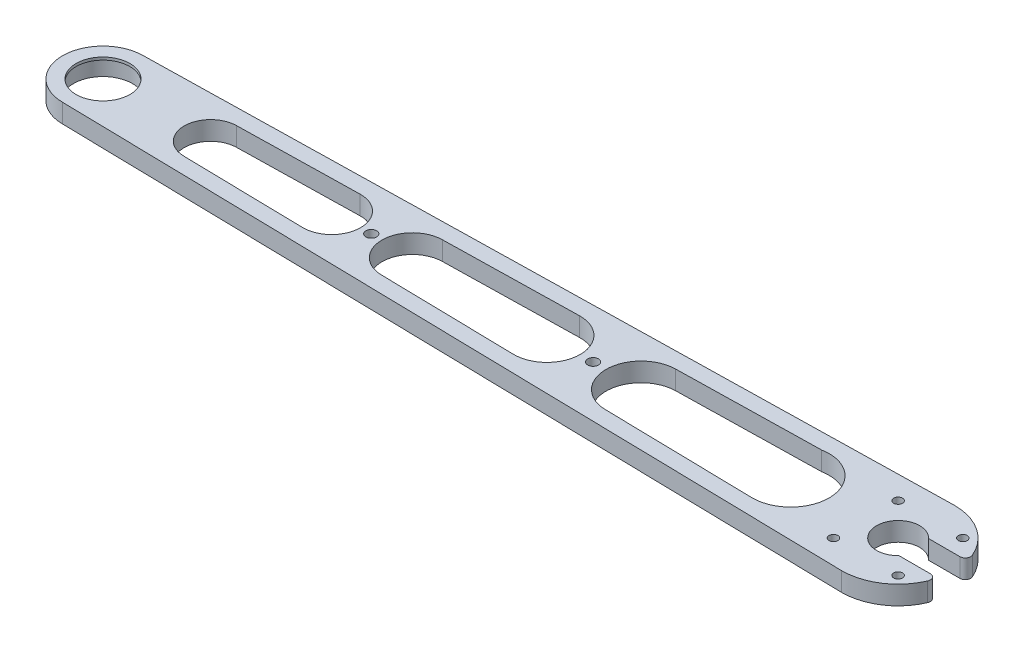
ISO-10303-21;
HEADER;
FILE_DESCRIPTION(('STEP AP214'),'2;1');
FILE_NAME('part.step','',(''),(''),'','','');
FILE_SCHEMA(('AUTOMOTIVE_DESIGN { 1 0 10303 214 1 1 1 1 }'));
ENDSEC;
DATA;
#1=APPLICATION_CONTEXT('core data for automotive mechanical design processes');
#2=APPLICATION_PROTOCOL_DEFINITION('international standard','automotive_design',2000,#1);
#3=PRODUCT_CONTEXT('',#1,'mechanical');
#4=PRODUCT('Part','Part','',(#3));
#5=PRODUCT_RELATED_PRODUCT_CATEGORY('part','',(#4));
#6=PRODUCT_DEFINITION_FORMATION('','',#4);
#7=PRODUCT_DEFINITION_CONTEXT('part definition',#1,'design');
#8=PRODUCT_DEFINITION('design','',#6,#7);
#9=PRODUCT_DEFINITION_SHAPE('','',#8);
#10=(LENGTH_UNIT() NAMED_UNIT(*) SI_UNIT(.MILLI.,.METRE.));
#11=(NAMED_UNIT(*) PLANE_ANGLE_UNIT() SI_UNIT($,.RADIAN.));
#12=(NAMED_UNIT(*) SI_UNIT($,.STERADIAN.) SOLID_ANGLE_UNIT());
#13=UNCERTAINTY_MEASURE_WITH_UNIT(LENGTH_MEASURE(1.E-05),#10,'distance_accuracy_value','');
#14=(GEOMETRIC_REPRESENTATION_CONTEXT(3) GLOBAL_UNCERTAINTY_ASSIGNED_CONTEXT((#13)) GLOBAL_UNIT_ASSIGNED_CONTEXT((#10,
#11,#12)) REPRESENTATION_CONTEXT('',''));
#15=CARTESIAN_POINT('',(0.,0.,0.));
#16=DIRECTION('',(0.,0.,1.));
#17=DIRECTION('',(1.,0.,0.));
#18=AXIS2_PLACEMENT_3D('',#15,#16,#17);
#19=CARTESIAN_POINT('',(264.937460861042,7.,7.5));
#20=DIRECTION('',(0.,-1.,0.));
#21=DIRECTION('',(0.,0.,-1.));
#22=AXIS2_PLACEMENT_3D('',#19,#20,#21);
#23=CYLINDRICAL_SURFACE('',#22,2.);
#24=CARTESIAN_POINT('',(264.937460861042,0.,7.5));
#25=DIRECTION('',(0.,1.,0.));
#26=DIRECTION('',(0.,0.,1.));
#27=AXIS2_PLACEMENT_3D('',#24,#25,#26);
#28=CIRCLE('',#27,2.);
#29=CARTESIAN_POINT('',(264.937460861042,0.,5.5));
#30=VERTEX_POINT('',#29);
#31=CARTESIAN_POINT('',(266.775049308421,0.,8.28947368421055));
#32=VERTEX_POINT('',#31);
#33=EDGE_CURVE('E353',#30,#32,#28,.F.);
#34=ORIENTED_EDGE('',*,*,#33,.F.);
#35=DIRECTION('',(0.,-1.,0.));
#36=VECTOR('',#35,1.);
#37=CARTESIAN_POINT('',(264.937460861042,7.,5.5));
#38=LINE('',#37,#36);
#39=CARTESIAN_POINT('',(264.937460861042,7.,5.5));
#40=VERTEX_POINT('',#39);
#41=EDGE_CURVE('E11',#40,#30,#38,.T.);
#42=ORIENTED_EDGE('',*,*,#41,.F.);
#43=CARTESIAN_POINT('',(264.937460861042,7.,7.5));
#44=DIRECTION('',(0.,1.,0.));
#45=DIRECTION('',(0.,0.,1.));
#46=AXIS2_PLACEMENT_3D('',#43,#44,#45);
#47=CIRCLE('',#46,2.);
#48=CARTESIAN_POINT('',(266.775049308421,7.,8.28947368421055));
#49=VERTEX_POINT('',#48);
#50=EDGE_CURVE('E357',#40,#49,#47,.F.);
#51=ORIENTED_EDGE('',*,*,#50,.T.);
#52=DIRECTION('',(0.,-1.,0.));
#53=VECTOR('',#52,1.);
#54=CARTESIAN_POINT('',(266.775049308421,7.,8.28947368421055));
#55=LINE('',#54,#53);
#56=EDGE_CURVE('E385',#49,#32,#55,.T.);
#57=ORIENTED_EDGE('',*,*,#56,.T.);
#58=EDGE_LOOP('',(#34,#42,#51,#57));
#59=FACE_BOUND('',#58,.T.);
#60=ADVANCED_FACE('F45',(#59),#23,.T.);
#61=CARTESIAN_POINT('',(0.,7.,5.49999999999998));
#62=DIRECTION('',(0.,0.,-1.));
#63=DIRECTION('',(-1.,0.,0.));
#64=AXIS2_PLACEMENT_3D('',#61,#62,#63);
#65=PLANE('',#64);
#66=DIRECTION('',(1.,0.,0.));
#67=VECTOR('',#66,1.);
#68=CARTESIAN_POINT('',(0.,0.,5.49999999999998));
#69=LINE('',#68,#67);
#70=CARTESIAN_POINT('',(253.289845630257,0.,5.5));
#71=VERTEX_POINT('',#70);
#72=EDGE_CURVE('E388',#71,#30,#69,.T.);
#73=ORIENTED_EDGE('',*,*,#72,.F.);
#74=DIRECTION('',(0.,-1.,0.));
#75=VECTOR('',#74,1.);
#76=CARTESIAN_POINT('',(253.289845630257,7.,5.5));
#77=LINE('',#76,#75);
#78=CARTESIAN_POINT('',(253.289845630257,7.,5.5));
#79=VERTEX_POINT('',#78);
#80=EDGE_CURVE('E54',#79,#71,#77,.T.);
#81=ORIENTED_EDGE('',*,*,#80,.F.);
#82=DIRECTION('',(1.,0.,0.));
#83=VECTOR('',#82,1.);
#84=CARTESIAN_POINT('',(0.,7.,5.49999999999998));
#85=LINE('',#84,#83);
#86=EDGE_CURVE('E361',#79,#40,#85,.T.);
#87=ORIENTED_EDGE('',*,*,#86,.T.);
#88=ORIENTED_EDGE('',*,*,#41,.T.);
#89=EDGE_LOOP('',(#73,#81,#87,#88));
#90=FACE_BOUND('',#89,.T.);
#91=ADVANCED_FACE('F457',(#90),#65,.T.);
#92=CARTESIAN_POINT('',(247.480370610946,7.,0.));
#93=DIRECTION('',(0.,-1.,0.));
#94=DIRECTION('',(0.,0.,-1.));
#95=AXIS2_PLACEMENT_3D('',#92,#93,#94);
#96=CYLINDRICAL_SURFACE('',#95,7.99999999999999);
#97=CARTESIAN_POINT('',(247.480370610946,0.,0.));
#98=DIRECTION('',(0.,1.,0.));
#99=DIRECTION('',(0.,0.,1.));
#100=AXIS2_PLACEMENT_3D('',#97,#98,#99);
#101=CIRCLE('',#100,7.99999999999999);
#102=CARTESIAN_POINT('',(253.289845630257,0.,-5.5));
#103=VERTEX_POINT('',#102);
#104=EDGE_CURVE('E391',#103,#71,#101,.T.);
#105=ORIENTED_EDGE('',*,*,#104,.F.);
#106=DIRECTION('',(0.,-1.,0.));
#107=VECTOR('',#106,1.);
#108=CARTESIAN_POINT('',(253.289845630257,7.,-5.5));
#109=LINE('',#108,#107);
#110=CARTESIAN_POINT('',(253.289845630257,7.,-5.5));
#111=VERTEX_POINT('',#110);
#112=EDGE_CURVE('E429',#111,#103,#109,.T.);
#113=ORIENTED_EDGE('',*,*,#112,.F.);
#114=CARTESIAN_POINT('',(247.480370610946,7.,0.));
#115=DIRECTION('',(0.,1.,0.));
#116=DIRECTION('',(0.,0.,1.));
#117=AXIS2_PLACEMENT_3D('',#114,#115,#116);
#118=CIRCLE('',#117,7.99999999999999);
#119=EDGE_CURVE('E364',#111,#79,#118,.T.);
#120=ORIENTED_EDGE('',*,*,#119,.T.);
#121=ORIENTED_EDGE('',*,*,#80,.T.);
#122=EDGE_LOOP('',(#105,#113,#120,#121));
#123=FACE_BOUND('',#122,.T.);
#124=ADVANCED_FACE('F462',(#123),#96,.F.);
#125=CARTESIAN_POINT('',(0.,7.,-5.5));
#126=DIRECTION('',(0.,0.,-1.));
#127=DIRECTION('',(-1.,0.,0.));
#128=AXIS2_PLACEMENT_3D('',#125,#126,#127);
#129=PLANE('',#128);
#130=DIRECTION('',(1.,0.,0.));
#131=VECTOR('',#130,1.);
#132=CARTESIAN_POINT('',(0.,0.,-5.5));
#133=LINE('',#132,#131);
#134=CARTESIAN_POINT('',(264.937460861042,0.,-5.5));
#135=VERTEX_POINT('',#134);
#136=EDGE_CURVE('E394',#103,#135,#133,.T.);
#137=ORIENTED_EDGE('',*,*,#136,.T.);
#138=DIRECTION('',(0.,-1.,0.));
#139=VECTOR('',#138,1.);
#140=CARTESIAN_POINT('',(264.937460861042,7.,-5.5));
#141=LINE('',#140,#139);
#142=CARTESIAN_POINT('',(264.937460861042,7.,-5.5));
#143=VERTEX_POINT('',#142);
#144=EDGE_CURVE('E426',#143,#135,#141,.T.);
#145=ORIENTED_EDGE('',*,*,#144,.F.);
#146=DIRECTION('',(1.,0.,0.));
#147=VECTOR('',#146,1.);
#148=CARTESIAN_POINT('',(0.,7.,-5.5));
#149=LINE('',#148,#147);
#150=EDGE_CURVE('E367',#111,#143,#149,.T.);
#151=ORIENTED_EDGE('',*,*,#150,.F.);
#152=ORIENTED_EDGE('',*,*,#112,.T.);
#153=EDGE_LOOP('',(#137,#145,#151,#152));
#154=FACE_BOUND('',#153,.T.);
#155=ADVANCED_FACE('F469',(#154),#129,.F.);
#156=CARTESIAN_POINT('',(264.937460861042,7.,-7.5));
#157=DIRECTION('',(0.,-1.,0.));
#158=DIRECTION('',(0.,0.,-1.));
#159=AXIS2_PLACEMENT_3D('',#156,#157,#158);
#160=CYLINDRICAL_SURFACE('',#159,2.);
#161=CARTESIAN_POINT('',(264.937460861042,0.,-7.5));
#162=DIRECTION('',(0.,1.,0.));
#163=DIRECTION('',(0.,0.,1.));
#164=AXIS2_PLACEMENT_3D('',#161,#162,#163);
#165=CIRCLE('',#164,2.);
#166=CARTESIAN_POINT('',(266.775049308421,0.,-8.28947368421055));
#167=VERTEX_POINT('',#166);
#168=EDGE_CURVE('E397',#135,#167,#165,.T.);
#169=ORIENTED_EDGE('',*,*,#168,.T.);
#170=DIRECTION('',(0.,-1.,0.));
#171=VECTOR('',#170,1.);
#172=CARTESIAN_POINT('',(266.775049308421,7.,-8.28947368421055));
#173=LINE('',#172,#171);
#174=CARTESIAN_POINT('',(266.775049308421,7.,-8.28947368421055));
#175=VERTEX_POINT('',#174);
#176=EDGE_CURVE('E423',#175,#167,#173,.T.);
#177=ORIENTED_EDGE('',*,*,#176,.F.);
#178=CARTESIAN_POINT('',(264.937460861042,7.,-7.5));
#179=DIRECTION('',(0.,1.,0.));
#180=DIRECTION('',(0.,0.,1.));
#181=AXIS2_PLACEMENT_3D('',#178,#179,#180);
#182=CIRCLE('',#181,2.);
#183=EDGE_CURVE('E370',#143,#175,#182,.T.);
#184=ORIENTED_EDGE('',*,*,#183,.F.);
#185=ORIENTED_EDGE('',*,*,#144,.T.);
#186=EDGE_LOOP('',(#169,#177,#184,#185));
#187=FACE_BOUND('',#186,.T.);
#188=ADVANCED_FACE('F473',(#187),#160,.T.);
#189=CARTESIAN_POINT('',(247.480370610946,7.,0.));
#190=DIRECTION('',(0.,-1.,0.));
#191=DIRECTION('',(0.,0.,-1.));
#192=AXIS2_PLACEMENT_3D('',#189,#190,#191);
#193=CYLINDRICAL_SURFACE('',#192,21.);
#194=CARTESIAN_POINT('',(247.480370610946,0.,0.));
#195=DIRECTION('',(0.,1.,0.));
#196=DIRECTION('',(0.,0.,1.));
#197=AXIS2_PLACEMENT_3D('',#194,#195,#196);
#198=CIRCLE('',#197,21.);
#199=CARTESIAN_POINT('',(247.480370610946,0.,-21.));
#200=VERTEX_POINT('',#199);
#201=EDGE_CURVE('E400',#167,#200,#198,.T.);
#202=ORIENTED_EDGE('',*,*,#201,.T.);
#203=DIRECTION('',(0.,-1.,0.));
#204=VECTOR('',#203,1.);
#205=CARTESIAN_POINT('',(247.480370610946,7.,-21.));
#206=LINE('',#205,#204);
#207=CARTESIAN_POINT('',(247.480370610946,7.,-21.));
#208=VERTEX_POINT('',#207);
#209=EDGE_CURVE('E421',#208,#200,#206,.T.);
#210=ORIENTED_EDGE('',*,*,#209,.F.);
#211=CARTESIAN_POINT('',(247.480370610946,7.,0.));
#212=DIRECTION('',(0.,1.,0.));
#213=DIRECTION('',(0.,0.,1.));
#214=AXIS2_PLACEMENT_3D('',#211,#212,#213);
#215=CIRCLE('',#214,21.);
#216=EDGE_CURVE('E373',#175,#208,#215,.T.);
#217=ORIENTED_EDGE('',*,*,#216,.F.);
#218=ORIENTED_EDGE('',*,*,#176,.T.);
#219=EDGE_LOOP('',(#202,#210,#217,#218));
#220=FACE_BOUND('',#219,.T.);
#221=ADVANCED_FACE('F477',(#220),#193,.T.);
#222=CARTESIAN_POINT('',(-0.324232171802316,7.,-15.968434461264));
#223=DIRECTION('',(-0.0203003842835679,0.,-0.999793925965716));
#224=DIRECTION('',(-0.999793925965716,0.,0.0203003842835679));
#225=AXIS2_PLACEMENT_3D('',#222,#223,#224);
#226=PLANE('',#225);
#227=DIRECTION('',(0.999793925965716,0.,-0.0203003842835679));
#228=VECTOR('',#227,1.);
#229=CARTESIAN_POINT('',(-0.324232171802316,0.,-15.968434461264));
#230=LINE('',#229,#228);
#231=CARTESIAN_POINT('',(-48.019629389054,0.,-15.));
#232=VERTEX_POINT('',#231);
#233=EDGE_CURVE('E403',#232,#200,#230,.T.);
#234=ORIENTED_EDGE('',*,*,#233,.F.);
#235=DIRECTION('',(0.,-1.,0.));
#236=VECTOR('',#235,1.);
#237=CARTESIAN_POINT('',(-48.019629389054,7.,-15.));
#238=LINE('',#237,#236);
#239=CARTESIAN_POINT('',(-48.019629389054,7.,-15.));
#240=VERTEX_POINT('',#239);
#241=EDGE_CURVE('E419',#240,#232,#238,.T.);
#242=ORIENTED_EDGE('',*,*,#241,.F.);
#243=DIRECTION('',(0.999793925965716,0.,-0.0203003842835679));
#244=VECTOR('',#243,1.);
#245=CARTESIAN_POINT('',(-0.324232171802316,7.,-15.968434461264));
#246=LINE('',#245,#244);
#247=EDGE_CURVE('E375',#240,#208,#246,.T.);
#248=ORIENTED_EDGE('',*,*,#247,.T.);
#249=ORIENTED_EDGE('',*,*,#209,.T.);
#250=EDGE_LOOP('',(#234,#242,#248,#249));
#251=FACE_BOUND('',#250,.T.);
#252=ADVANCED_FACE('F481',(#251),#226,.T.);
#253=CARTESIAN_POINT('',(-48.019629389054,7.,0.));
#254=DIRECTION('',(0.,-1.,0.));
#255=DIRECTION('',(0.,0.,-1.));
#256=AXIS2_PLACEMENT_3D('',#253,#254,#255);
#257=CYLINDRICAL_SURFACE('',#256,15.);
#258=CARTESIAN_POINT('',(-48.019629389054,0.,0.));
#259=DIRECTION('',(0.,1.,0.));
#260=DIRECTION('',(0.,0.,1.));
#261=AXIS2_PLACEMENT_3D('',#258,#259,#260);
#262=CIRCLE('',#261,15.);
#263=CARTESIAN_POINT('',(-48.019629389054,0.,15.));
#264=VERTEX_POINT('',#263);
#265=EDGE_CURVE('E406',#232,#264,#262,.T.);
#266=ORIENTED_EDGE('',*,*,#265,.T.);
#267=DIRECTION('',(0.,-1.,0.));
#268=VECTOR('',#267,1.);
#269=CARTESIAN_POINT('',(-48.019629389054,7.,15.));
#270=LINE('',#269,#268);
#271=CARTESIAN_POINT('',(-48.019629389054,7.,15.));
#272=VERTEX_POINT('',#271);
#273=EDGE_CURVE('E417',#272,#264,#270,.T.);
#274=ORIENTED_EDGE('',*,*,#273,.F.);
#275=CARTESIAN_POINT('',(-48.019629389054,7.,0.));
#276=DIRECTION('',(0.,1.,0.));
#277=DIRECTION('',(0.,0.,1.));
#278=AXIS2_PLACEMENT_3D('',#275,#276,#277);
#279=CIRCLE('',#278,15.);
#280=EDGE_CURVE('E378',#240,#272,#279,.T.);
#281=ORIENTED_EDGE('',*,*,#280,.F.);
#282=ORIENTED_EDGE('',*,*,#241,.T.);
#283=EDGE_LOOP('',(#266,#274,#281,#282));
#284=FACE_BOUND('',#283,.T.);
#285=ADVANCED_FACE('F485',(#284),#257,.T.);
#286=CARTESIAN_POINT('',(-0.324232171802316,7.,15.968434461264));
#287=DIRECTION('',(-0.0203003842835679,0.,0.999793925965716));
#288=DIRECTION('',(0.999793925965716,0.,0.0203003842835679));
#289=AXIS2_PLACEMENT_3D('',#286,#287,#288);
#290=PLANE('',#289);
#291=DIRECTION('',(-0.999793925965716,0.,-0.0203003842835679));
#292=VECTOR('',#291,1.);
#293=CARTESIAN_POINT('',(-0.324232171802316,0.,15.968434461264));
#294=LINE('',#293,#292);
#295=CARTESIAN_POINT('',(247.480370610946,0.,21.));
#296=VERTEX_POINT('',#295);
#297=EDGE_CURVE('E409',#296,#264,#294,.T.);
#298=ORIENTED_EDGE('',*,*,#297,.F.);
#299=DIRECTION('',(0.,-1.,0.));
#300=VECTOR('',#299,1.);
#301=CARTESIAN_POINT('',(247.480370610946,7.,21.));
#302=LINE('',#301,#300);
#303=CARTESIAN_POINT('',(247.480370610946,7.,21.));
#304=VERTEX_POINT('',#303);
#305=EDGE_CURVE('E415',#304,#296,#302,.T.);
#306=ORIENTED_EDGE('',*,*,#305,.F.);
#307=DIRECTION('',(-0.999793925965716,0.,-0.0203003842835679));
#308=VECTOR('',#307,1.);
#309=CARTESIAN_POINT('',(-0.324232171802316,7.,15.968434461264));
#310=LINE('',#309,#308);
#311=EDGE_CURVE('E380',#304,#272,#310,.T.);
#312=ORIENTED_EDGE('',*,*,#311,.T.);
#313=ORIENTED_EDGE('',*,*,#273,.T.);
#314=EDGE_LOOP('',(#298,#306,#312,#313));
#315=FACE_BOUND('',#314,.T.);
#316=ADVANCED_FACE('F489',(#315),#290,.T.);
#317=CARTESIAN_POINT('',(-48.019629389054,7.,0.));
#318=DIRECTION('',(0.,-1.,0.));
#319=DIRECTION('',(0.,0.,-1.));
#320=AXIS2_PLACEMENT_3D('',#317,#318,#319);
#321=CYLINDRICAL_SURFACE('',#320,10.);
#322=CARTESIAN_POINT('',(-48.019629389054,6.,0.));
#323=DIRECTION('',(0.,1.,0.));
#324=DIRECTION('',(0.,0.,1.));
#325=AXIS2_PLACEMENT_3D('',#322,#323,#324);
#326=CIRCLE('',#325,10.);
#327=CARTESIAN_POINT('',(-48.019629389054,6.,10.));
#328=VERTEX_POINT('',#327);
#329=EDGE_CURVE('E49',#328,#328,#326,.T.);
#330=ORIENTED_EDGE('',*,*,#329,.F.);
#331=EDGE_LOOP('',(#330));
#332=FACE_BOUND('',#331,.T.);
#333=CARTESIAN_POINT('',(-48.019629389054,7.,0.));
#334=DIRECTION('',(0.,1.,0.));
#335=DIRECTION('',(0.,0.,1.));
#336=AXIS2_PLACEMENT_3D('',#333,#334,#335);
#337=CIRCLE('',#336,10.);
#338=CARTESIAN_POINT('',(-48.019629389054,7.,10.));
#339=VERTEX_POINT('',#338);
#340=EDGE_CURVE('E354',#339,#339,#337,.T.);
#341=ORIENTED_EDGE('',*,*,#340,.T.);
#342=EDGE_LOOP('',(#341));
#343=FACE_BOUND('',#342,.T.);
#344=ADVANCED_FACE('F47',(#332,#343),#321,.F.);
#345=CARTESIAN_POINT('',(247.480370610946,7.,0.));
#346=DIRECTION('',(0.,-1.,0.));
#347=DIRECTION('',(0.,0.,-1.));
#348=AXIS2_PLACEMENT_3D('',#345,#346,#347);
#349=CYLINDRICAL_SURFACE('',#348,21.);
#350=CARTESIAN_POINT('',(247.480370610946,0.,0.));
#351=DIRECTION('',(0.,1.,0.));
#352=DIRECTION('',(0.,0.,1.));
#353=AXIS2_PLACEMENT_3D('',#350,#351,#352);
#354=CIRCLE('',#353,21.);
#355=EDGE_CURVE('E358',#296,#32,#354,.T.);
#356=ORIENTED_EDGE('',*,*,#355,.T.);
#357=ORIENTED_EDGE('',*,*,#56,.F.);
#358=CARTESIAN_POINT('',(247.480370610946,7.,0.));
#359=DIRECTION('',(0.,1.,0.));
#360=DIRECTION('',(0.,0.,1.));
#361=AXIS2_PLACEMENT_3D('',#358,#359,#360);
#362=CIRCLE('',#361,21.);
#363=EDGE_CURVE('E383',#304,#49,#362,.T.);
#364=ORIENTED_EDGE('',*,*,#363,.F.);
#365=ORIENTED_EDGE('',*,*,#305,.T.);
#366=EDGE_LOOP('',(#356,#357,#364,#365));
#367=FACE_BOUND('',#366,.T.);
#368=ADVANCED_FACE('F494',(#367),#349,.T.);
#369=CARTESIAN_POINT('',(0.,7.,0.));
#370=DIRECTION('',(0.,1.,0.));
#371=DIRECTION('',(0.,0.,1.));
#372=AXIS2_PLACEMENT_3D('',#369,#370,#371);
#373=PLANE('',#372);
#374=CARTESIAN_POINT('',(-8.01962938905402,7.,0.));
#375=DIRECTION('',(0.,-1.,0.));
#376=DIRECTION('',(0.,0.,-1.));
#377=AXIS2_PLACEMENT_3D('',#374,#375,#376);
#378=CIRCLE('',#377,9.80892426082845);
#379=CARTESIAN_POINT('',(-8.21875432095725,7.,9.80690289623403));
#380=VERTEX_POINT('',#379);
#381=CARTESIAN_POINT('',(-8.21875432095725,7.,-9.80690289623404));
#382=VERTEX_POINT('',#381);
#383=EDGE_CURVE('E205',#380,#382,#378,.T.);
#384=ORIENTED_EDGE('',*,*,#383,.T.);
#385=DIRECTION('',(0.999793925965716,0.,-0.020300384283568));
#386=VECTOR('',#385,1.);
#387=CARTESIAN_POINT('',(-8.21875432095725,7.,-9.80690289623404));
#388=LINE('',#387,#386);
#389=CARTESIAN_POINT('',(36.7627009269499,7.,-10.7202319368007));
#390=VERTEX_POINT('',#389);
#391=EDGE_CURVE('E216',#382,#390,#388,.T.);
#392=ORIENTED_EDGE('',*,*,#391,.T.);
#393=CARTESIAN_POINT('',(36.9803706109458,7.,0.));
#394=DIRECTION('',(0.,-1.,0.));
#395=DIRECTION('',(0.,0.,1.));
#396=AXIS2_PLACEMENT_3D('',#393,#394,#395);
#397=CIRCLE('',#396,10.722441553589);
#398=CARTESIAN_POINT('',(36.7627009269499,7.,10.7202319368007));
#399=VERTEX_POINT('',#398);
#400=EDGE_CURVE('E62',#390,#399,#397,.T.);
#401=ORIENTED_EDGE('',*,*,#400,.T.);
#402=DIRECTION('',(-0.999793925965716,0.,-0.0203003842835682));
#403=VECTOR('',#402,1.);
#404=CARTESIAN_POINT('',(-8.21875432095725,7.,9.80690289623403));
#405=LINE('',#404,#403);
#406=EDGE_CURVE('E213',#399,#380,#405,.T.);
#407=ORIENTED_EDGE('',*,*,#406,.T.);
#408=EDGE_LOOP('',(#384,#392,#401,#407));
#409=FACE_BOUND('',#408,.T.);
#410=CARTESIAN_POINT('',(51.6758648466924,7.,0.));
#411=DIRECTION('',(0.,-1.,0.));
#412=DIRECTION('',(0.,0.,-1.));
#413=AXIS2_PLACEMENT_3D('',#410,#411,#412);
#414=CIRCLE('',#413,2.);
#415=CARTESIAN_POINT('',(51.6758648466924,7.,-2.00000000000003));
#416=VERTEX_POINT('',#415);
#417=EDGE_CURVE('E250',#416,#416,#414,.T.);
#418=ORIENTED_EDGE('',*,*,#417,.T.);
#419=EDGE_LOOP('',(#418));
#420=FACE_BOUND('',#419,.T.);
#421=CARTESIAN_POINT('',(134.125113885984,7.,0.));
#422=DIRECTION('',(0.,-1.,0.));
#423=DIRECTION('',(0.,0.,-1.));
#424=AXIS2_PLACEMENT_3D('',#421,#422,#423);
#425=CIRCLE('',#424,2.);
#426=CARTESIAN_POINT('',(134.125113885984,7.,-2.00000000000003));
#427=VERTEX_POINT('',#426);
#428=EDGE_CURVE('E243',#427,#427,#425,.T.);
#429=ORIENTED_EDGE('',*,*,#428,.T.);
#430=EDGE_LOOP('',(#429));
#431=FACE_BOUND('',#430,.T.);
#432=CARTESIAN_POINT('',(66.9803706109442,7.,0.));
#433=DIRECTION('',(0.,-1.,0.));
#434=DIRECTION('',(0.,0.,1.));
#435=AXIS2_PLACEMENT_3D('',#432,#433,#434);
#436=CIRCLE('',#435,11.331453082096);
#437=CARTESIAN_POINT('',(66.7503377588864,7.,11.3291179638451));
#438=VERTEX_POINT('',#437);
#439=CARTESIAN_POINT('',(66.7503377588865,7.,-11.3291179638451));
#440=VERTEX_POINT('',#439);
#441=EDGE_CURVE('E288',#438,#440,#436,.T.);
#442=ORIENTED_EDGE('',*,*,#441,.T.);
#443=DIRECTION('',(0.999793925965716,0.,-0.0203003842835679));
#444=VECTOR('',#443,1.);
#445=CARTESIAN_POINT('',(66.7503377588865,7.,-11.3291179638451));
#446=LINE('',#445,#444);
#447=CARTESIAN_POINT('',(116.729732478784,7.,-12.3439280089191));
#448=VERTEX_POINT('',#447);
#449=EDGE_CURVE('E291',#440,#448,#446,.T.);
#450=ORIENTED_EDGE('',*,*,#449,.T.);
#451=CARTESIAN_POINT('',(116.980370610944,7.,0.));
#452=DIRECTION('',(0.,-1.,0.));
#453=DIRECTION('',(0.,0.,-1.));
#454=AXIS2_PLACEMENT_3D('',#451,#452,#453);
#455=CIRCLE('',#454,12.3464722962744);
#456=CARTESIAN_POINT('',(116.729732478784,7.,12.3439280089192));
#457=VERTEX_POINT('',#456);
#458=EDGE_CURVE('E70',#448,#457,#455,.T.);
#459=ORIENTED_EDGE('',*,*,#458,.T.);
#460=DIRECTION('',(-0.999793925965716,0.,-0.020300384283568));
#461=VECTOR('',#460,1.);
#462=CARTESIAN_POINT('',(66.7503377588864,7.,11.3291179638451));
#463=LINE('',#462,#461);
#464=EDGE_CURVE('E296',#457,#438,#463,.T.);
#465=ORIENTED_EDGE('',*,*,#464,.T.);
#466=EDGE_LOOP('',(#442,#450,#459,#465));
#467=FACE_BOUND('',#466,.T.);
#468=CARTESIAN_POINT('',(207.480474963479,7.,-0.0913684395745021));
#469=DIRECTION('',(0.,-1.,0.));
#470=DIRECTION('',(0.,0.,1.));
#471=AXIS2_PLACEMENT_3D('',#468,#469,#470);
#472=CIRCLE('',#471,14.2750088032454);
#473=CARTESIAN_POINT('',(204.918313244168,7.,-14.1345590904498));
#474=VERTEX_POINT('',#473);
#475=CARTESIAN_POINT('',(207.190686799122,7.,14.1806986550174));
#476=VERTEX_POINT('',#475);
#477=EDGE_CURVE('E256',#474,#476,#472,.T.);
#478=ORIENTED_EDGE('',*,*,#477,.T.);
#479=DIRECTION('',(-0.999793925965716,0.,-0.020300384283568));
#480=VECTOR('',#479,1.);
#481=CARTESIAN_POINT('',(151.715308782712,7.,13.054295040471));
#482=LINE('',#481,#480);
#483=CARTESIAN_POINT('',(151.715308782712,7.,13.054295040471));
#484=VERTEX_POINT('',#483);
#485=EDGE_CURVE('E259',#476,#484,#482,.T.);
#486=ORIENTED_EDGE('',*,*,#485,.T.);
#487=CARTESIAN_POINT('',(151.980370610945,7.,0.));
#488=DIRECTION('',(0.,-1.,0.));
#489=DIRECTION('',(0.,0.,1.));
#490=AXIS2_PLACEMENT_3D('',#487,#488,#489);
#491=CIRCLE('',#490,13.0569857461993);
#492=CARTESIAN_POINT('',(151.715308782712,7.,-13.054295040471));
#493=VERTEX_POINT('',#492);
#494=EDGE_CURVE('E263',#484,#493,#491,.T.);
#495=ORIENTED_EDGE('',*,*,#494,.T.);
#496=DIRECTION('',(0.999793925965716,0.,-0.0203003842835679));
#497=VECTOR('',#496,1.);
#498=CARTESIAN_POINT('',(151.715308782712,7.,-13.054295040471));
#499=LINE('',#498,#497);
#500=EDGE_CURVE('E266',#493,#474,#499,.T.);
#501=ORIENTED_EDGE('',*,*,#500,.T.);
#502=EDGE_LOOP('',(#478,#486,#495,#501));
#503=FACE_BOUND('',#502,.T.);
#504=CARTESIAN_POINT('',(235.459555330775,7.,-12.0208152801712));
#505=DIRECTION('',(0.,1.,0.));
#506=DIRECTION('',(0.,0.,1.));
#507=AXIS2_PLACEMENT_3D('',#504,#505,#506);
#508=CIRCLE('',#507,1.65000000000001);
#509=CARTESIAN_POINT('',(235.459555330775,7.,-10.3708152801712));
#510=VERTEX_POINT('',#509);
#511=EDGE_CURVE('E333',#510,#510,#508,.T.);
#512=ORIENTED_EDGE('',*,*,#511,.F.);
#513=EDGE_LOOP('',(#512));
#514=FACE_BOUND('',#513,.T.);
#515=CARTESIAN_POINT('',(235.459555330775,7.,12.0208152801715));
#516=DIRECTION('',(0.,1.,0.));
#517=DIRECTION('',(0.,0.,1.));
#518=AXIS2_PLACEMENT_3D('',#515,#516,#517);
#519=CIRCLE('',#518,1.65000000000001);
#520=CARTESIAN_POINT('',(235.459555330775,7.,13.6708152801716));
#521=VERTEX_POINT('',#520);
#522=EDGE_CURVE('E337',#521,#521,#519,.T.);
#523=ORIENTED_EDGE('',*,*,#522,.F.);
#524=EDGE_LOOP('',(#523));
#525=FACE_BOUND('',#524,.T.);
#526=CARTESIAN_POINT('',(259.501185891117,7.,12.0208152801711));
#527=DIRECTION('',(0.,1.,0.));
#528=DIRECTION('',(0.,0.,1.));
#529=AXIS2_PLACEMENT_3D('',#526,#527,#528);
#530=CIRCLE('',#529,1.64999999999998);
#531=CARTESIAN_POINT('',(259.501185891117,7.,13.6708152801711));
#532=VERTEX_POINT('',#531);
#533=EDGE_CURVE('E343',#532,#532,#530,.T.);
#534=ORIENTED_EDGE('',*,*,#533,.F.);
#535=EDGE_LOOP('',(#534));
#536=FACE_BOUND('',#535,.T.);
#537=CARTESIAN_POINT('',(259.501185891117,7.,-12.0208152801715));
#538=DIRECTION('',(0.,1.,0.));
#539=DIRECTION('',(0.,0.,1.));
#540=AXIS2_PLACEMENT_3D('',#537,#538,#539);
#541=CIRCLE('',#540,1.64999999999998);
#542=CARTESIAN_POINT('',(259.501185891117,7.,-10.3708152801716));
#543=VERTEX_POINT('',#542);
#544=EDGE_CURVE('E347',#543,#543,#541,.T.);
#545=ORIENTED_EDGE('',*,*,#544,.F.);
#546=EDGE_LOOP('',(#545));
#547=FACE_BOUND('',#546,.T.);
#548=ORIENTED_EDGE('',*,*,#340,.F.);
#549=EDGE_LOOP('',(#548));
#550=FACE_BOUND('',#549,.T.);
#551=ORIENTED_EDGE('',*,*,#50,.F.);
#552=ORIENTED_EDGE('',*,*,#86,.F.);
#553=ORIENTED_EDGE('',*,*,#119,.F.);
#554=ORIENTED_EDGE('',*,*,#150,.T.);
#555=ORIENTED_EDGE('',*,*,#183,.T.);
#556=ORIENTED_EDGE('',*,*,#216,.T.);
#557=ORIENTED_EDGE('',*,*,#247,.F.);
#558=ORIENTED_EDGE('',*,*,#280,.T.);
#559=ORIENTED_EDGE('',*,*,#311,.F.);
#560=ORIENTED_EDGE('',*,*,#363,.T.);
#561=EDGE_LOOP('',(#551,#552,#553,#554,#555,#556,#557,#558,#559,#560));
#562=FACE_BOUND('',#561,.T.);
#563=ADVANCED_FACE('F220',(#409,#420,#431,#467,#503,#514,#525,#536,#547,#550,#562),#373,.T.);
#564=CARTESIAN_POINT('',(0.,0.,0.));
#565=DIRECTION('',(0.,1.,0.));
#566=DIRECTION('',(0.,0.,1.));
#567=AXIS2_PLACEMENT_3D('',#564,#565,#566);
#568=PLANE('',#567);
#569=DIRECTION('',(0.999793925965716,0.,-0.020300384283568));
#570=VECTOR('',#569,1.);
#571=CARTESIAN_POINT('',(-8.21875432095725,0.,-9.80690289623404));
#572=LINE('',#571,#570);
#573=CARTESIAN_POINT('',(-8.21875432095725,0.,-9.80690289623404));
#574=VERTEX_POINT('',#573);
#575=CARTESIAN_POINT('',(36.7627009269499,0.,-10.7202319368007));
#576=VERTEX_POINT('',#575);
#577=EDGE_CURVE('E232',#574,#576,#572,.T.);
#578=ORIENTED_EDGE('',*,*,#577,.F.);
#579=CARTESIAN_POINT('',(-8.01962938905402,0.,0.));
#580=DIRECTION('',(0.,-1.,0.));
#581=DIRECTION('',(0.,0.,-1.));
#582=AXIS2_PLACEMENT_3D('',#579,#580,#581);
#583=CIRCLE('',#582,9.80892426082845);
#584=CARTESIAN_POINT('',(-8.21875432095725,0.,9.80690289623403));
#585=VERTEX_POINT('',#584);
#586=EDGE_CURVE('E208',#585,#574,#583,.T.);
#587=ORIENTED_EDGE('',*,*,#586,.F.);
#588=DIRECTION('',(-0.999793925965716,0.,-0.0203003842835682));
#589=VECTOR('',#588,1.);
#590=CARTESIAN_POINT('',(-8.21875432095725,0.,9.80690289623403));
#591=LINE('',#590,#589);
#592=CARTESIAN_POINT('',(36.7627009269499,0.,10.7202319368007));
#593=VERTEX_POINT('',#592);
#594=EDGE_CURVE('E223',#593,#585,#591,.T.);
#595=ORIENTED_EDGE('',*,*,#594,.F.);
#596=CARTESIAN_POINT('',(36.9803706109458,0.,0.));
#597=DIRECTION('',(0.,-1.,0.));
#598=DIRECTION('',(0.,0.,1.));
#599=AXIS2_PLACEMENT_3D('',#596,#597,#598);
#600=CIRCLE('',#599,10.722441553589);
#601=EDGE_CURVE('E226',#576,#593,#600,.T.);
#602=ORIENTED_EDGE('',*,*,#601,.F.);
#603=EDGE_LOOP('',(#578,#587,#595,#602));
#604=FACE_BOUND('',#603,.T.);
#605=CARTESIAN_POINT('',(51.6758648466924,0.,0.));
#606=DIRECTION('',(0.,-1.,0.));
#607=DIRECTION('',(0.,0.,-1.));
#608=AXIS2_PLACEMENT_3D('',#605,#606,#607);
#609=CIRCLE('',#608,2.);
#610=CARTESIAN_POINT('',(51.6758648466924,0.,-2.00000000000003));
#611=VERTEX_POINT('',#610);
#612=EDGE_CURVE('E253',#611,#611,#609,.T.);
#613=ORIENTED_EDGE('',*,*,#612,.F.);
#614=EDGE_LOOP('',(#613));
#615=FACE_BOUND('',#614,.T.);
#616=CARTESIAN_POINT('',(134.125113885984,0.,0.));
#617=DIRECTION('',(0.,-1.,0.));
#618=DIRECTION('',(0.,0.,-1.));
#619=AXIS2_PLACEMENT_3D('',#616,#617,#618);
#620=CIRCLE('',#619,2.);
#621=CARTESIAN_POINT('',(134.125113885984,0.,-2.00000000000003));
#622=VERTEX_POINT('',#621);
#623=EDGE_CURVE('E247',#622,#622,#620,.T.);
#624=ORIENTED_EDGE('',*,*,#623,.F.);
#625=EDGE_LOOP('',(#624));
#626=FACE_BOUND('',#625,.T.);
#627=DIRECTION('',(0.999793925965716,0.,-0.0203003842835679));
#628=VECTOR('',#627,1.);
#629=CARTESIAN_POINT('',(66.7503377588865,0.,-11.3291179638451));
#630=LINE('',#629,#628);
#631=CARTESIAN_POINT('',(66.7503377588865,0.,-11.3291179638451));
#632=VERTEX_POINT('',#631);
#633=CARTESIAN_POINT('',(116.729732478784,0.,-12.3439280089191));
#634=VERTEX_POINT('',#633);
#635=EDGE_CURVE('E301',#632,#634,#630,.T.);
#636=ORIENTED_EDGE('',*,*,#635,.F.);
#637=CARTESIAN_POINT('',(66.9803706109442,0.,0.));
#638=DIRECTION('',(0.,-1.,0.));
#639=DIRECTION('',(0.,0.,1.));
#640=AXIS2_PLACEMENT_3D('',#637,#638,#639);
#641=CIRCLE('',#640,11.331453082096);
#642=CARTESIAN_POINT('',(66.7503377588864,0.,11.3291179638451));
#643=VERTEX_POINT('',#642);
#644=EDGE_CURVE('E246',#643,#632,#641,.T.);
#645=ORIENTED_EDGE('',*,*,#644,.F.);
#646=DIRECTION('',(-0.999793925965716,0.,-0.020300384283568));
#647=VECTOR('',#646,1.);
#648=CARTESIAN_POINT('',(66.7503377588864,0.,11.3291179638451));
#649=LINE('',#648,#647);
#650=CARTESIAN_POINT('',(116.729732478784,0.,12.3439280089192));
#651=VERTEX_POINT('',#650);
#652=EDGE_CURVE('E292',#651,#643,#649,.T.);
#653=ORIENTED_EDGE('',*,*,#652,.F.);
#654=CARTESIAN_POINT('',(116.980370610944,0.,0.));
#655=DIRECTION('',(0.,-1.,0.));
#656=DIRECTION('',(0.,0.,-1.));
#657=AXIS2_PLACEMENT_3D('',#654,#655,#656);
#658=CIRCLE('',#657,12.3464722962744);
#659=EDGE_CURVE('E304',#634,#651,#658,.T.);
#660=ORIENTED_EDGE('',*,*,#659,.F.);
#661=EDGE_LOOP('',(#636,#645,#653,#660));
#662=FACE_BOUND('',#661,.T.);
#663=DIRECTION('',(-0.999793925965716,0.,-0.020300384283568));
#664=VECTOR('',#663,1.);
#665=CARTESIAN_POINT('',(151.715308782712,0.,13.054295040471));
#666=LINE('',#665,#664);
#667=CARTESIAN_POINT('',(207.190686799122,0.,14.1806986550174));
#668=VERTEX_POINT('',#667);
#669=CARTESIAN_POINT('',(151.715308782712,0.,13.054295040471));
#670=VERTEX_POINT('',#669);
#671=EDGE_CURVE('E272',#668,#670,#666,.T.);
#672=ORIENTED_EDGE('',*,*,#671,.F.);
#673=CARTESIAN_POINT('',(207.480474963479,0.,-0.0913684395745021));
#674=DIRECTION('',(0.,-1.,0.));
#675=DIRECTION('',(0.,0.,1.));
#676=AXIS2_PLACEMENT_3D('',#673,#674,#675);
#677=CIRCLE('',#676,14.2750088032454);
#678=CARTESIAN_POINT('',(204.918313244168,0.,-14.1345590904498));
#679=VERTEX_POINT('',#678);
#680=EDGE_CURVE('E270',#679,#668,#677,.T.);
#681=ORIENTED_EDGE('',*,*,#680,.F.);
#682=DIRECTION('',(0.999793925965716,0.,-0.0203003842835679));
#683=VECTOR('',#682,1.);
#684=CARTESIAN_POINT('',(151.715308782712,0.,-13.054295040471));
#685=LINE('',#684,#683);
#686=CARTESIAN_POINT('',(151.715308782712,0.,-13.054295040471));
#687=VERTEX_POINT('',#686);
#688=EDGE_CURVE('E260',#687,#679,#685,.T.);
#689=ORIENTED_EDGE('',*,*,#688,.F.);
#690=CARTESIAN_POINT('',(151.980370610945,0.,0.));
#691=DIRECTION('',(0.,-1.,0.));
#692=DIRECTION('',(0.,0.,1.));
#693=AXIS2_PLACEMENT_3D('',#690,#691,#692);
#694=CIRCLE('',#693,13.0569857461993);
#695=EDGE_CURVE('E276',#670,#687,#694,.T.);
#696=ORIENTED_EDGE('',*,*,#695,.F.);
#697=EDGE_LOOP('',(#672,#681,#689,#696));
#698=FACE_BOUND('',#697,.T.);
#699=CARTESIAN_POINT('',(-33.019629389054,0.,10.));
#700=DIRECTION('',(0.,-1.,0.));
#701=DIRECTION('',(0.,0.,-1.));
#702=AXIS2_PLACEMENT_3D('',#699,#700,#701);
#703=CIRCLE('',#702,1.65);
#704=CARTESIAN_POINT('',(-33.019629389054,0.,8.35));
#705=VERTEX_POINT('',#704);
#706=EDGE_CURVE('E239',#705,#705,#703,.T.);
#707=ORIENTED_EDGE('',*,*,#706,.F.);
#708=EDGE_LOOP('',(#707));
#709=FACE_BOUND('',#708,.T.);
#710=CARTESIAN_POINT('',(-33.019629389054,0.,-10.));
#711=DIRECTION('',(0.,-1.,0.));
#712=DIRECTION('',(0.,0.,-1.));
#713=AXIS2_PLACEMENT_3D('',#710,#711,#712);
#714=CIRCLE('',#713,1.65);
#715=CARTESIAN_POINT('',(-33.019629389054,0.,-11.65));
#716=VERTEX_POINT('',#715);
#717=EDGE_CURVE('E321',#716,#716,#714,.T.);
#718=ORIENTED_EDGE('',*,*,#717,.F.);
#719=EDGE_LOOP('',(#718));
#720=FACE_BOUND('',#719,.T.);
#721=CARTESIAN_POINT('',(-48.019629389054,0.,0.));
#722=DIRECTION('',(0.,1.,0.));
#723=DIRECTION('',(0.,0.,1.));
#724=AXIS2_PLACEMENT_3D('',#721,#722,#723);
#725=CIRCLE('',#724,11.);
#726=CARTESIAN_POINT('',(-48.019629389054,0.,11.));
#727=VERTEX_POINT('',#726);
#728=EDGE_CURVE('E327',#727,#727,#725,.T.);
#729=ORIENTED_EDGE('',*,*,#728,.T.);
#730=EDGE_LOOP('',(#729));
#731=FACE_BOUND('',#730,.T.);
#732=CARTESIAN_POINT('',(235.459555330775,0.,-12.0208152801712));
#733=DIRECTION('',(0.,1.,0.));
#734=DIRECTION('',(0.,0.,1.));
#735=AXIS2_PLACEMENT_3D('',#732,#733,#734);
#736=CIRCLE('',#735,1.65);
#737=CARTESIAN_POINT('',(235.459555330775,0.,-10.3708152801712));
#738=VERTEX_POINT('',#737);
#739=EDGE_CURVE('E336',#738,#738,#736,.T.);
#740=ORIENTED_EDGE('',*,*,#739,.T.);
#741=EDGE_LOOP('',(#740));
#742=FACE_BOUND('',#741,.T.);
#743=CARTESIAN_POINT('',(235.459555330775,0.,12.0208152801715));
#744=DIRECTION('',(0.,1.,0.));
#745=DIRECTION('',(0.,0.,1.));
#746=AXIS2_PLACEMENT_3D('',#743,#744,#745);
#747=CIRCLE('',#746,1.65);
#748=CARTESIAN_POINT('',(235.459555330775,0.,13.6708152801715));
#749=VERTEX_POINT('',#748);
#750=EDGE_CURVE('E340',#749,#749,#747,.T.);
#751=ORIENTED_EDGE('',*,*,#750,.T.);
#752=EDGE_LOOP('',(#751));
#753=FACE_BOUND('',#752,.T.);
#754=CARTESIAN_POINT('',(259.501185891117,0.,12.0208152801711));
#755=DIRECTION('',(0.,1.,0.));
#756=DIRECTION('',(0.,0.,1.));
#757=AXIS2_PLACEMENT_3D('',#754,#755,#756);
#758=CIRCLE('',#757,1.64999999999998);
#759=CARTESIAN_POINT('',(259.501185891117,0.,13.6708152801711));
#760=VERTEX_POINT('',#759);
#761=EDGE_CURVE('E346',#760,#760,#758,.T.);
#762=ORIENTED_EDGE('',*,*,#761,.T.);
#763=EDGE_LOOP('',(#762));
#764=FACE_BOUND('',#763,.T.);
#765=CARTESIAN_POINT('',(259.501185891117,0.,-12.0208152801715));
#766=DIRECTION('',(0.,1.,0.));
#767=DIRECTION('',(0.,0.,1.));
#768=AXIS2_PLACEMENT_3D('',#765,#766,#767);
#769=CIRCLE('',#768,1.64999999999998);
#770=CARTESIAN_POINT('',(259.501185891117,0.,-10.3708152801716));
#771=VERTEX_POINT('',#770);
#772=EDGE_CURVE('E350',#771,#771,#769,.T.);
#773=ORIENTED_EDGE('',*,*,#772,.T.);
#774=EDGE_LOOP('',(#773));
#775=FACE_BOUND('',#774,.T.);
#776=ORIENTED_EDGE('',*,*,#33,.T.);
#777=ORIENTED_EDGE('',*,*,#355,.F.);
#778=ORIENTED_EDGE('',*,*,#297,.T.);
#779=ORIENTED_EDGE('',*,*,#265,.F.);
#780=ORIENTED_EDGE('',*,*,#233,.T.);
#781=ORIENTED_EDGE('',*,*,#201,.F.);
#782=ORIENTED_EDGE('',*,*,#168,.F.);
#783=ORIENTED_EDGE('',*,*,#136,.F.);
#784=ORIENTED_EDGE('',*,*,#104,.T.);
#785=ORIENTED_EDGE('',*,*,#72,.T.);
#786=EDGE_LOOP('',(#776,#777,#778,#779,#780,#781,#782,#783,#784,#785));
#787=FACE_BOUND('',#786,.T.);
#788=ADVANCED_FACE('F436',(#604,#615,#626,#662,#698,#709,#720,#731,#742,#753,#764,#775,#787),
#568,.F.);
#789=CARTESIAN_POINT('',(259.501185891117,7.,-12.0208152801715));
#790=DIRECTION('',(0.,1.,0.));
#791=DIRECTION('',(0.,0.,1.));
#792=AXIS2_PLACEMENT_3D('',#789,#790,#791);
#793=CYLINDRICAL_SURFACE('',#792,1.64999999999998);
#794=ORIENTED_EDGE('',*,*,#544,.T.);
#795=EDGE_LOOP('',(#794));
#796=FACE_BOUND('',#795,.T.);
#797=ORIENTED_EDGE('',*,*,#772,.F.);
#798=EDGE_LOOP('',(#797));
#799=FACE_BOUND('',#798,.T.);
#800=ADVANCED_FACE('F500',(#796,#799),#793,.F.);
#801=CARTESIAN_POINT('',(259.501185891117,7.,12.0208152801711));
#802=DIRECTION('',(0.,1.,0.));
#803=DIRECTION('',(0.,0.,1.));
#804=AXIS2_PLACEMENT_3D('',#801,#802,#803);
#805=CYLINDRICAL_SURFACE('',#804,1.64999999999998);
#806=ORIENTED_EDGE('',*,*,#533,.T.);
#807=EDGE_LOOP('',(#806));
#808=FACE_BOUND('',#807,.T.);
#809=ORIENTED_EDGE('',*,*,#761,.F.);
#810=EDGE_LOOP('',(#809));
#811=FACE_BOUND('',#810,.T.);
#812=ADVANCED_FACE('F453',(#808,#811),#805,.F.);
#813=CARTESIAN_POINT('',(235.459555330775,7.,12.0208152801715));
#814=DIRECTION('',(0.,1.,0.));
#815=DIRECTION('',(0.,0.,1.));
#816=AXIS2_PLACEMENT_3D('',#813,#814,#815);
#817=CYLINDRICAL_SURFACE('',#816,1.65);
#818=ORIENTED_EDGE('',*,*,#522,.T.);
#819=EDGE_LOOP('',(#818));
#820=FACE_BOUND('',#819,.T.);
#821=ORIENTED_EDGE('',*,*,#750,.F.);
#822=EDGE_LOOP('',(#821));
#823=FACE_BOUND('',#822,.T.);
#824=ADVANCED_FACE('F442',(#820,#823),#817,.F.);
#825=CARTESIAN_POINT('',(235.459555330775,7.,-12.0208152801712));
#826=DIRECTION('',(0.,1.,0.));
#827=DIRECTION('',(0.,0.,1.));
#828=AXIS2_PLACEMENT_3D('',#825,#826,#827);
#829=CYLINDRICAL_SURFACE('',#828,1.65);
#830=ORIENTED_EDGE('',*,*,#511,.T.);
#831=EDGE_LOOP('',(#830));
#832=FACE_BOUND('',#831,.T.);
#833=ORIENTED_EDGE('',*,*,#739,.F.);
#834=EDGE_LOOP('',(#833));
#835=FACE_BOUND('',#834,.T.);
#836=ADVANCED_FACE('F439',(#832,#835),#829,.F.);
#837=CARTESIAN_POINT('',(-48.019629389054,6.,0.));
#838=DIRECTION('',(0.,-1.,0.));
#839=DIRECTION('',(0.,0.,-1.));
#840=AXIS2_PLACEMENT_3D('',#837,#838,#839);
#841=CYLINDRICAL_SURFACE('',#840,11.);
#842=CARTESIAN_POINT('',(-48.019629389054,6.,0.));
#843=DIRECTION('',(0.,1.,0.));
#844=DIRECTION('',(0.,0.,1.));
#845=AXIS2_PLACEMENT_3D('',#842,#843,#844);
#846=CIRCLE('',#845,11.);
#847=CARTESIAN_POINT('',(-48.019629389054,6.,11.));
#848=VERTEX_POINT('',#847);
#849=EDGE_CURVE('E328',#848,#848,#846,.T.);
#850=ORIENTED_EDGE('',*,*,#849,.T.);
#851=EDGE_LOOP('',(#850));
#852=FACE_BOUND('',#851,.T.);
#853=ORIENTED_EDGE('',*,*,#728,.F.);
#854=EDGE_LOOP('',(#853));
#855=FACE_BOUND('',#854,.T.);
#856=ADVANCED_FACE('F441',(#852,#855),#841,.F.);
#857=CARTESIAN_POINT('',(-48.019629389054,6.,0.));
#858=DIRECTION('',(0.,1.,0.));
#859=DIRECTION('',(0.,0.,1.));
#860=AXIS2_PLACEMENT_3D('',#857,#858,#859);
#861=PLANE('',#860);
#862=ORIENTED_EDGE('',*,*,#329,.T.);
#863=EDGE_LOOP('',(#862));
#864=FACE_BOUND('',#863,.T.);
#865=ORIENTED_EDGE('',*,*,#849,.F.);
#866=EDGE_LOOP('',(#865));
#867=FACE_BOUND('',#866,.T.);
#868=ADVANCED_FACE('F450',(#864,#867),#861,.F.);
#869=CARTESIAN_POINT('',(-33.019629389054,5.,-10.));
#870=DIRECTION('',(0.,-1.,0.));
#871=DIRECTION('',(0.,0.,-1.));
#872=AXIS2_PLACEMENT_3D('',#869,#870,#871);
#873=CONICAL_SURFACE('',#872,1.65,1.02974425867665);
#874=CARTESIAN_POINT('',(-33.019629389054,5.99142002139547,-10.));
#875=VERTEX_POINT('',#874);
#876=VERTEX_LOOP('',#875);
#877=FACE_BOUND('',#876,.T.);
#878=CARTESIAN_POINT('',(-33.019629389054,5.,-10.));
#879=DIRECTION('',(0.,-1.,0.));
#880=DIRECTION('',(0.,0.,-1.));
#881=AXIS2_PLACEMENT_3D('',#878,#879,#880);
#882=CIRCLE('',#881,1.65);
#883=CARTESIAN_POINT('',(-33.019629389054,5.,-11.65));
#884=VERTEX_POINT('',#883);
#885=EDGE_CURVE('E324',#884,#884,#882,.T.);
#886=ORIENTED_EDGE('',*,*,#885,.T.);
#887=EDGE_LOOP('',(#886));
#888=FACE_BOUND('',#887,.T.);
#889=ADVANCED_FACE('F554',(#877,#888),#873,.F.);
#890=CARTESIAN_POINT('',(-33.019629389054,0.,-10.));
#891=DIRECTION('',(0.,-1.,0.));
#892=DIRECTION('',(0.,0.,-1.));
#893=AXIS2_PLACEMENT_3D('',#890,#891,#892);
#894=CYLINDRICAL_SURFACE('',#893,1.65);
#895=ORIENTED_EDGE('',*,*,#885,.F.);
#896=EDGE_LOOP('',(#895));
#897=FACE_BOUND('',#896,.T.);
#898=ORIENTED_EDGE('',*,*,#717,.T.);
#899=EDGE_LOOP('',(#898));
#900=FACE_BOUND('',#899,.T.);
#901=ADVANCED_FACE('F563',(#897,#900),#894,.F.);
#902=CARTESIAN_POINT('',(-33.019629389054,5.,10.));
#903=DIRECTION('',(0.,-1.,0.));
#904=DIRECTION('',(0.,0.,-1.));
#905=AXIS2_PLACEMENT_3D('',#902,#903,#904);
#906=CONICAL_SURFACE('',#905,1.65,1.02974425867665);
#907=CARTESIAN_POINT('',(-33.019629389054,5.99142002139547,10.));
#908=VERTEX_POINT('',#907);
#909=VERTEX_LOOP('',#908);
#910=FACE_BOUND('',#909,.T.);
#911=CARTESIAN_POINT('',(-33.019629389054,5.,10.));
#912=DIRECTION('',(0.,-1.,0.));
#913=DIRECTION('',(0.,0.,-1.));
#914=AXIS2_PLACEMENT_3D('',#911,#912,#913);
#915=CIRCLE('',#914,1.65);
#916=CARTESIAN_POINT('',(-33.019629389054,5.,8.35));
#917=VERTEX_POINT('',#916);
#918=EDGE_CURVE('E318',#917,#917,#915,.T.);
#919=ORIENTED_EDGE('',*,*,#918,.T.);
#920=EDGE_LOOP('',(#919));
#921=FACE_BOUND('',#920,.T.);
#922=ADVANCED_FACE('F569',(#910,#921),#906,.F.);
#923=CARTESIAN_POINT('',(-33.019629389054,0.,10.));
#924=DIRECTION('',(0.,-1.,0.));
#925=DIRECTION('',(0.,0.,-1.));
#926=AXIS2_PLACEMENT_3D('',#923,#924,#925);
#927=CYLINDRICAL_SURFACE('',#926,1.65);
#928=ORIENTED_EDGE('',*,*,#918,.F.);
#929=EDGE_LOOP('',(#928));
#930=FACE_BOUND('',#929,.T.);
#931=ORIENTED_EDGE('',*,*,#706,.T.);
#932=EDGE_LOOP('',(#931));
#933=FACE_BOUND('',#932,.T.);
#934=ADVANCED_FACE('F573',(#930,#933),#927,.F.);
#935=CARTESIAN_POINT('',(207.480474963479,7.,-0.0913684395745021));
#936=DIRECTION('',(0.,-1.,0.));
#937=DIRECTION('',(0.,0.,-1.));
#938=AXIS2_PLACEMENT_3D('',#935,#936,#937);
#939=CYLINDRICAL_SURFACE('',#938,14.2750088032454);
#940=ORIENTED_EDGE('',*,*,#680,.T.);
#941=DIRECTION('',(0.,-1.,0.));
#942=VECTOR('',#941,1.);
#943=CARTESIAN_POINT('',(207.190686799122,7.,14.1806986550174));
#944=LINE('',#943,#942);
#945=EDGE_CURVE('E269',#476,#668,#944,.T.);
#946=ORIENTED_EDGE('',*,*,#945,.F.);
#947=ORIENTED_EDGE('',*,*,#477,.F.);
#948=DIRECTION('',(0.,-1.,0.));
#949=VECTOR('',#948,1.);
#950=CARTESIAN_POINT('',(204.918313244168,7.,-14.1345590904498));
#951=LINE('',#950,#949);
#952=EDGE_CURVE('E233',#474,#679,#951,.T.);
#953=ORIENTED_EDGE('',*,*,#952,.T.);
#954=EDGE_LOOP('',(#940,#946,#947,#953));
#955=FACE_BOUND('',#954,.T.);
#956=ADVANCED_FACE('F577',(#955),#939,.F.);
#957=CARTESIAN_POINT('',(151.715308782712,7.,-13.054295040471));
#958=DIRECTION('',(-0.0203003842835679,0.,-0.999793925965716));
#959=DIRECTION('',(-0.999793925965716,0.,0.0203003842835679));
#960=AXIS2_PLACEMENT_3D('',#957,#958,#959);
#961=PLANE('',#960);
#962=ORIENTED_EDGE('',*,*,#688,.T.);
#963=ORIENTED_EDGE('',*,*,#952,.F.);
#964=ORIENTED_EDGE('',*,*,#500,.F.);
#965=DIRECTION('',(0.,-1.,0.));
#966=VECTOR('',#965,1.);
#967=CARTESIAN_POINT('',(151.715308782712,7.,-13.054295040471));
#968=LINE('',#967,#966);
#969=EDGE_CURVE('E282',#493,#687,#968,.T.);
#970=ORIENTED_EDGE('',*,*,#969,.T.);
#971=EDGE_LOOP('',(#962,#963,#964,#970));
#972=FACE_BOUND('',#971,.T.);
#973=ADVANCED_FACE('F598',(#972),#961,.F.);
#974=CARTESIAN_POINT('',(151.980370610945,7.,0.));
#975=DIRECTION('',(0.,-1.,0.));
#976=DIRECTION('',(0.,0.,-1.));
#977=AXIS2_PLACEMENT_3D('',#974,#975,#976);
#978=CYLINDRICAL_SURFACE('',#977,13.0569857461993);
#979=ORIENTED_EDGE('',*,*,#695,.T.);
#980=ORIENTED_EDGE('',*,*,#969,.F.);
#981=ORIENTED_EDGE('',*,*,#494,.F.);
#982=DIRECTION('',(0.,-1.,0.));
#983=VECTOR('',#982,1.);
#984=CARTESIAN_POINT('',(151.715308782712,7.,13.054295040471));
#985=LINE('',#984,#983);
#986=EDGE_CURVE('E284',#484,#670,#985,.T.);
#987=ORIENTED_EDGE('',*,*,#986,.T.);
#988=EDGE_LOOP('',(#979,#980,#981,#987));
#989=FACE_BOUND('',#988,.T.);
#990=ADVANCED_FACE('F602',(#989),#978,.F.);
#991=CARTESIAN_POINT('',(151.715308782712,7.,13.054295040471));
#992=DIRECTION('',(-0.020300384283568,0.,0.999793925965716));
#993=DIRECTION('',(0.999793925965716,0.,0.020300384283568));
#994=AXIS2_PLACEMENT_3D('',#991,#992,#993);
#995=PLANE('',#994);
#996=ORIENTED_EDGE('',*,*,#671,.T.);
#997=ORIENTED_EDGE('',*,*,#986,.F.);
#998=ORIENTED_EDGE('',*,*,#485,.F.);
#999=ORIENTED_EDGE('',*,*,#945,.T.);
#1000=EDGE_LOOP('',(#996,#997,#998,#999));
#1001=FACE_BOUND('',#1000,.T.);
#1002=ADVANCED_FACE('F583',(#1001),#995,.F.);
#1003=CARTESIAN_POINT('',(66.9803706109442,7.,0.));
#1004=DIRECTION('',(0.,-1.,0.));
#1005=DIRECTION('',(0.,0.,-1.));
#1006=AXIS2_PLACEMENT_3D('',#1003,#1004,#1005);
#1007=CYLINDRICAL_SURFACE('',#1006,11.331453082096);
#1008=ORIENTED_EDGE('',*,*,#644,.T.);
#1009=DIRECTION('',(0.,-1.,0.));
#1010=VECTOR('',#1009,1.);
#1011=CARTESIAN_POINT('',(66.7503377588865,7.,-11.3291179638451));
#1012=LINE('',#1011,#1010);
#1013=EDGE_CURVE('E299',#440,#632,#1012,.T.);
#1014=ORIENTED_EDGE('',*,*,#1013,.F.);
#1015=ORIENTED_EDGE('',*,*,#441,.F.);
#1016=DIRECTION('',(0.,-1.,0.));
#1017=VECTOR('',#1016,1.);
#1018=CARTESIAN_POINT('',(66.7503377588864,7.,11.3291179638451));
#1019=LINE('',#1018,#1017);
#1020=EDGE_CURVE('E273',#438,#643,#1019,.T.);
#1021=ORIENTED_EDGE('',*,*,#1020,.T.);
#1022=EDGE_LOOP('',(#1008,#1014,#1015,#1021));
#1023=FACE_BOUND('',#1022,.T.);
#1024=ADVANCED_FACE('F579',(#1023),#1007,.F.);
#1025=CARTESIAN_POINT('',(66.7503377588864,7.,11.3291179638451));
#1026=DIRECTION('',(-0.020300384283568,0.,0.999793925965716));
#1027=DIRECTION('',(0.999793925965716,0.,0.020300384283568));
#1028=AXIS2_PLACEMENT_3D('',#1025,#1026,#1027);
#1029=PLANE('',#1028);
#1030=ORIENTED_EDGE('',*,*,#652,.T.);
#1031=ORIENTED_EDGE('',*,*,#1020,.F.);
#1032=ORIENTED_EDGE('',*,*,#464,.F.);
#1033=DIRECTION('',(0.,-1.,0.));
#1034=VECTOR('',#1033,1.);
#1035=CARTESIAN_POINT('',(116.729732478784,7.,12.3439280089192));
#1036=LINE('',#1035,#1034);
#1037=EDGE_CURVE('E310',#457,#651,#1036,.T.);
#1038=ORIENTED_EDGE('',*,*,#1037,.T.);
#1039=EDGE_LOOP('',(#1030,#1031,#1032,#1038));
#1040=FACE_BOUND('',#1039,.T.);
#1041=ADVANCED_FACE('F582',(#1040),#1029,.F.);
#1042=CARTESIAN_POINT('',(116.980370610944,7.,0.));
#1043=DIRECTION('',(0.,-1.,0.));
#1044=DIRECTION('',(0.,0.,-1.));
#1045=AXIS2_PLACEMENT_3D('',#1042,#1043,#1044);
#1046=CYLINDRICAL_SURFACE('',#1045,12.3464722962744);
#1047=ORIENTED_EDGE('',*,*,#659,.T.);
#1048=ORIENTED_EDGE('',*,*,#1037,.F.);
#1049=ORIENTED_EDGE('',*,*,#458,.F.);
#1050=DIRECTION('',(0.,-1.,0.));
#1051=VECTOR('',#1050,1.);
#1052=CARTESIAN_POINT('',(116.729732478784,7.,-12.3439280089191));
#1053=LINE('',#1052,#1051);
#1054=EDGE_CURVE('E312',#448,#634,#1053,.T.);
#1055=ORIENTED_EDGE('',*,*,#1054,.T.);
#1056=EDGE_LOOP('',(#1047,#1048,#1049,#1055));
#1057=FACE_BOUND('',#1056,.T.);
#1058=ADVANCED_FACE('F589',(#1057),#1046,.F.);
#1059=CARTESIAN_POINT('',(66.7503377588865,7.,-11.3291179638451));
#1060=DIRECTION('',(-0.0203003842835679,0.,-0.999793925965716));
#1061=DIRECTION('',(-0.999793925965716,0.,0.0203003842835679));
#1062=AXIS2_PLACEMENT_3D('',#1059,#1060,#1061);
#1063=PLANE('',#1062);
#1064=ORIENTED_EDGE('',*,*,#635,.T.);
#1065=ORIENTED_EDGE('',*,*,#1054,.F.);
#1066=ORIENTED_EDGE('',*,*,#449,.F.);
#1067=ORIENTED_EDGE('',*,*,#1013,.T.);
#1068=EDGE_LOOP('',(#1064,#1065,#1066,#1067));
#1069=FACE_BOUND('',#1068,.T.);
#1070=ADVANCED_FACE('F585',(#1069),#1063,.F.);
#1071=CARTESIAN_POINT('',(134.125113885984,7.,0.));
#1072=DIRECTION('',(0.,-1.,0.));
#1073=DIRECTION('',(0.,0.,-1.));
#1074=AXIS2_PLACEMENT_3D('',#1071,#1072,#1073);
#1075=CYLINDRICAL_SURFACE('',#1074,2.);
#1076=ORIENTED_EDGE('',*,*,#428,.F.);
#1077=EDGE_LOOP('',(#1076));
#1078=FACE_BOUND('',#1077,.T.);
#1079=ORIENTED_EDGE('',*,*,#623,.T.);
#1080=EDGE_LOOP('',(#1079));
#1081=FACE_BOUND('',#1080,.T.);
#1082=ADVANCED_FACE('F588',(#1078,#1081),#1075,.F.);
#1083=CARTESIAN_POINT('',(51.6758648466924,7.,0.));
#1084=DIRECTION('',(0.,-1.,0.));
#1085=DIRECTION('',(0.,0.,-1.));
#1086=AXIS2_PLACEMENT_3D('',#1083,#1084,#1085);
#1087=CYLINDRICAL_SURFACE('',#1086,2.);
#1088=ORIENTED_EDGE('',*,*,#417,.F.);
#1089=EDGE_LOOP('',(#1088));
#1090=FACE_BOUND('',#1089,.T.);
#1091=ORIENTED_EDGE('',*,*,#612,.T.);
#1092=EDGE_LOOP('',(#1091));
#1093=FACE_BOUND('',#1092,.T.);
#1094=ADVANCED_FACE('F610',(#1090,#1093),#1087,.F.);
#1095=CARTESIAN_POINT('',(-8.01962938905402,7.,0.));
#1096=DIRECTION('',(0.,-1.,0.));
#1097=DIRECTION('',(0.,0.,-1.));
#1098=AXIS2_PLACEMENT_3D('',#1095,#1096,#1097);
#1099=CYLINDRICAL_SURFACE('',#1098,9.80892426082845);
#1100=ORIENTED_EDGE('',*,*,#586,.T.);
#1101=DIRECTION('',(0.,-1.,0.));
#1102=VECTOR('',#1101,1.);
#1103=CARTESIAN_POINT('',(-8.21875432095725,7.,-9.80690289623404));
#1104=LINE('',#1103,#1102);
#1105=EDGE_CURVE('E201',#382,#574,#1104,.T.);
#1106=ORIENTED_EDGE('',*,*,#1105,.F.);
#1107=ORIENTED_EDGE('',*,*,#383,.F.);
#1108=DIRECTION('',(0.,-1.,0.));
#1109=VECTOR('',#1108,1.);
#1110=CARTESIAN_POINT('',(-8.21875432095725,7.,9.80690289623403));
#1111=LINE('',#1110,#1109);
#1112=EDGE_CURVE('E237',#380,#585,#1111,.T.);
#1113=ORIENTED_EDGE('',*,*,#1112,.T.);
#1114=EDGE_LOOP('',(#1100,#1106,#1107,#1113));
#1115=FACE_BOUND('',#1114,.T.);
#1116=ADVANCED_FACE('F203',(#1115),#1099,.F.);
#1117=CARTESIAN_POINT('',(-8.21875432095725,7.,9.80690289623403));
#1118=DIRECTION('',(-0.0203003842835682,0.,0.999793925965716));
#1119=DIRECTION('',(0.999793925965716,0.,0.0203003842835682));
#1120=AXIS2_PLACEMENT_3D('',#1117,#1118,#1119);
#1121=PLANE('',#1120);
#1122=ORIENTED_EDGE('',*,*,#594,.T.);
#1123=ORIENTED_EDGE('',*,*,#1112,.F.);
#1124=ORIENTED_EDGE('',*,*,#406,.F.);
#1125=DIRECTION('',(0.,-1.,0.));
#1126=VECTOR('',#1125,1.);
#1127=CARTESIAN_POINT('',(36.7627009269499,7.,10.7202319368007));
#1128=LINE('',#1127,#1126);
#1129=EDGE_CURVE('E240',#399,#593,#1128,.T.);
#1130=ORIENTED_EDGE('',*,*,#1129,.T.);
#1131=EDGE_LOOP('',(#1122,#1123,#1124,#1130));
#1132=FACE_BOUND('',#1131,.T.);
#1133=ADVANCED_FACE('F619',(#1132),#1121,.F.);
#1134=CARTESIAN_POINT('',(36.9803706109458,7.,0.));
#1135=DIRECTION('',(0.,-1.,0.));
#1136=DIRECTION('',(0.,0.,-1.));
#1137=AXIS2_PLACEMENT_3D('',#1134,#1135,#1136);
#1138=CYLINDRICAL_SURFACE('',#1137,10.722441553589);
#1139=ORIENTED_EDGE('',*,*,#601,.T.);
#1140=ORIENTED_EDGE('',*,*,#1129,.F.);
#1141=ORIENTED_EDGE('',*,*,#400,.F.);
#1142=DIRECTION('',(0.,-1.,0.));
#1143=VECTOR('',#1142,1.);
#1144=CARTESIAN_POINT('',(36.7627009269499,7.,-10.7202319368007));
#1145=LINE('',#1144,#1143);
#1146=EDGE_CURVE('E212',#390,#576,#1145,.T.);
#1147=ORIENTED_EDGE('',*,*,#1146,.T.);
#1148=EDGE_LOOP('',(#1139,#1140,#1141,#1147));
#1149=FACE_BOUND('',#1148,.T.);
#1150=ADVANCED_FACE('F622',(#1149),#1138,.F.);
#1151=CARTESIAN_POINT('',(-8.21875432095725,7.,-9.80690289623404));
#1152=DIRECTION('',(-0.020300384283568,0.,-0.999793925965716));
#1153=DIRECTION('',(-0.999793925965716,0.,0.020300384283568));
#1154=AXIS2_PLACEMENT_3D('',#1151,#1152,#1153);
#1155=PLANE('',#1154);
#1156=ORIENTED_EDGE('',*,*,#577,.T.);
#1157=ORIENTED_EDGE('',*,*,#1146,.F.);
#1158=ORIENTED_EDGE('',*,*,#391,.F.);
#1159=ORIENTED_EDGE('',*,*,#1105,.T.);
#1160=EDGE_LOOP('',(#1156,#1157,#1158,#1159));
#1161=FACE_BOUND('',#1160,.T.);
#1162=ADVANCED_FACE('F217',(#1161),#1155,.F.);
#1163=CLOSED_SHELL('',(#60,#91,#124,#155,#188,#221,#252,#285,#316,#344,#368,#563,#788,#800,#812,
#824,#836,#856,#868,#889,#901,#922,#934,#956,#973,#990,#1002,#1024,#1041,#1058,#1070,#1082,
#1094,#1116,#1133,#1150,#1162));
#1164=MANIFOLD_SOLID_BREP('B2',#1163);
#1165=ADVANCED_BREP_SHAPE_REPRESENTATION('',(#18,#1164),#14);
#1166=SHAPE_DEFINITION_REPRESENTATION(#9,#1165);
ENDSEC;
END-ISO-10303-21;
